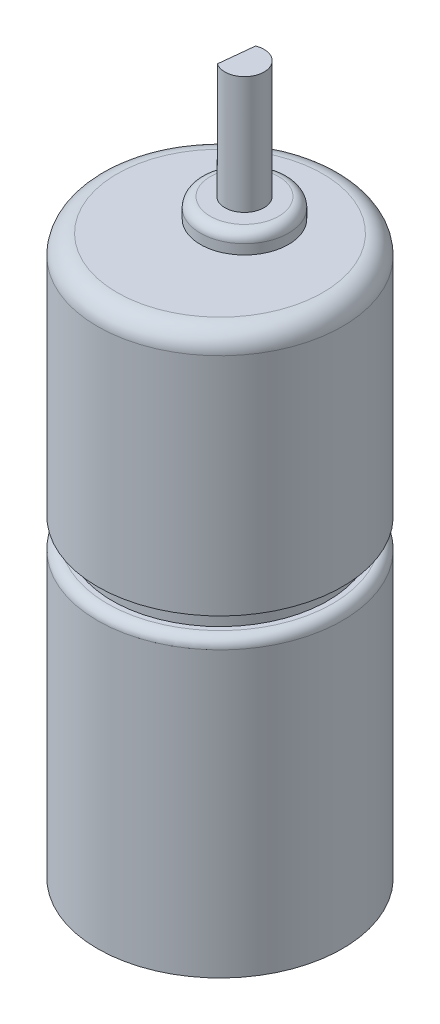
ISO-10303-21;
HEADER;
FILE_DESCRIPTION(('STEP AP214'),'2;1');
FILE_NAME('part.step','',(''),(''),'','','');
FILE_SCHEMA(('AUTOMOTIVE_DESIGN { 1 0 10303 214 1 1 1 1 }'));
ENDSEC;
DATA;
#1=APPLICATION_CONTEXT('core data for automotive mechanical design processes');
#2=APPLICATION_PROTOCOL_DEFINITION('international standard','automotive_design',2000,#1);
#3=PRODUCT_CONTEXT('',#1,'mechanical');
#4=PRODUCT('Part','Part','',(#3));
#5=PRODUCT_RELATED_PRODUCT_CATEGORY('part','',(#4));
#6=PRODUCT_DEFINITION_FORMATION('','',#4);
#7=PRODUCT_DEFINITION_CONTEXT('part definition',#1,'design');
#8=PRODUCT_DEFINITION('design','',#6,#7);
#9=PRODUCT_DEFINITION_SHAPE('','',#8);
#10=(LENGTH_UNIT() NAMED_UNIT(*) SI_UNIT(.MILLI.,.METRE.));
#11=(NAMED_UNIT(*) PLANE_ANGLE_UNIT() SI_UNIT($,.RADIAN.));
#12=(NAMED_UNIT(*) SI_UNIT($,.STERADIAN.) SOLID_ANGLE_UNIT());
#13=UNCERTAINTY_MEASURE_WITH_UNIT(LENGTH_MEASURE(1.E-05),#10,'distance_accuracy_value','');
#14=(GEOMETRIC_REPRESENTATION_CONTEXT(3) GLOBAL_UNCERTAINTY_ASSIGNED_CONTEXT((#13)) GLOBAL_UNIT_ASSIGNED_CONTEXT((#10,
#11,#12)) REPRESENTATION_CONTEXT('',''));
#15=CARTESIAN_POINT('',(0.,0.,0.));
#16=DIRECTION('',(0.,0.,1.));
#17=DIRECTION('',(1.,0.,0.));
#18=AXIS2_PLACEMENT_3D('',#15,#16,#17);
#19=CARTESIAN_POINT('',(0.,25.,0.));
#20=DIRECTION('',(0.,-1.,0.));
#21=DIRECTION('',(0.,0.,-1.));
#22=AXIS2_PLACEMENT_3D('',#19,#20,#21);
#23=CYLINDRICAL_SURFACE('',#22,12.5);
#24=CARTESIAN_POINT('',(0.,23.,0.));
#25=DIRECTION('',(0.,1.,0.));
#26=DIRECTION('',(0.,0.,1.));
#27=AXIS2_PLACEMENT_3D('',#24,#25,#26);
#28=CIRCLE('',#27,12.5);
#29=CARTESIAN_POINT('',(0.,23.,12.5));
#30=VERTEX_POINT('',#29);
#31=EDGE_CURVE('E113',#30,#30,#28,.F.);
#32=ORIENTED_EDGE('',*,*,#31,.T.);
#33=EDGE_LOOP('',(#32));
#34=FACE_BOUND('',#33,.T.);
#35=CARTESIAN_POINT('',(0.,0.,0.));
#36=DIRECTION('',(0.,1.,0.));
#37=DIRECTION('',(0.,0.,1.));
#38=AXIS2_PLACEMENT_3D('',#35,#36,#37);
#39=CIRCLE('',#38,12.5);
#40=CARTESIAN_POINT('',(0.,0.,12.5));
#41=VERTEX_POINT('',#40);
#42=EDGE_CURVE('E101',#41,#41,#39,.T.);
#43=ORIENTED_EDGE('',*,*,#42,.T.);
#44=EDGE_LOOP('',(#43));
#45=FACE_BOUND('',#44,.T.);
#46=ADVANCED_FACE('F42',(#34,#45),#23,.T.);
#47=CARTESIAN_POINT('',(0.,25.,0.));
#48=DIRECTION('',(0.,1.,0.));
#49=DIRECTION('',(0.,0.,1.));
#50=AXIS2_PLACEMENT_3D('',#47,#48,#49);
#51=PLANE('',#50);
#52=CARTESIAN_POINT('',(0.,25.,0.));
#53=DIRECTION('',(0.,1.,0.));
#54=DIRECTION('',(0.,0.,1.));
#55=AXIS2_PLACEMENT_3D('',#52,#53,#54);
#56=CIRCLE('',#55,10.5);
#57=CARTESIAN_POINT('',(0.,25.,10.5));
#58=VERTEX_POINT('',#57);
#59=EDGE_CURVE('E106',#58,#58,#56,.T.);
#60=ORIENTED_EDGE('',*,*,#59,.T.);
#61=EDGE_LOOP('',(#60));
#62=FACE_BOUND('',#61,.T.);
#63=CARTESIAN_POINT('',(0.,25.,-2.5));
#64=DIRECTION('',(0.,-1.,0.));
#65=DIRECTION('',(0.,0.,-1.));
#66=AXIS2_PLACEMENT_3D('',#63,#64,#65);
#67=CIRCLE('',#66,4.5);
#68=CARTESIAN_POINT('',(0.,25.,-7.));
#69=VERTEX_POINT('',#68);
#70=EDGE_CURVE('E86',#69,#69,#67,.T.);
#71=ORIENTED_EDGE('',*,*,#70,.T.);
#72=EDGE_LOOP('',(#71));
#73=FACE_BOUND('',#72,.T.);
#74=ADVANCED_FACE('F146',(#62,#73),#51,.T.);
#75=CARTESIAN_POINT('',(0.,0.,0.));
#76=DIRECTION('',(0.,1.,0.));
#77=DIRECTION('',(0.,0.,1.));
#78=AXIS2_PLACEMENT_3D('',#75,#76,#77);
#79=PLANE('',#78);
#80=CARTESIAN_POINT('',(0.,0.,0.));
#81=DIRECTION('',(0.,-1.,0.));
#82=DIRECTION('',(0.,0.,-1.));
#83=AXIS2_PLACEMENT_3D('',#80,#81,#82);
#84=CIRCLE('',#83,11.);
#85=CARTESIAN_POINT('',(0.,0.,-11.));
#86=VERTEX_POINT('',#85);
#87=EDGE_CURVE('E102',#86,#86,#84,.T.);
#88=ORIENTED_EDGE('',*,*,#87,.F.);
#89=EDGE_LOOP('',(#88));
#90=FACE_BOUND('',#89,.T.);
#91=ORIENTED_EDGE('',*,*,#42,.F.);
#92=EDGE_LOOP('',(#91));
#93=FACE_BOUND('',#92,.T.);
#94=ADVANCED_FACE('F148',(#90,#93),#79,.F.);
#95=CARTESIAN_POINT('',(0.,-2.,0.));
#96=DIRECTION('',(0.,1.,0.));
#97=DIRECTION('',(0.,0.,1.));
#98=AXIS2_PLACEMENT_3D('',#95,#96,#97);
#99=CYLINDRICAL_SURFACE('',#98,11.);
#100=CARTESIAN_POINT('',(0.,-2.,0.));
#101=DIRECTION('',(0.,-1.,0.));
#102=DIRECTION('',(0.,0.,-1.));
#103=AXIS2_PLACEMENT_3D('',#100,#101,#102);
#104=CIRCLE('',#103,11.);
#105=CARTESIAN_POINT('',(0.,-2.,-11.));
#106=VERTEX_POINT('',#105);
#107=EDGE_CURVE('E97',#106,#106,#104,.T.);
#108=ORIENTED_EDGE('',*,*,#107,.F.);
#109=EDGE_LOOP('',(#108));
#110=FACE_BOUND('',#109,.T.);
#111=ORIENTED_EDGE('',*,*,#87,.T.);
#112=EDGE_LOOP('',(#111));
#113=FACE_BOUND('',#112,.T.);
#114=ADVANCED_FACE('F155',(#110,#113),#99,.T.);
#115=CARTESIAN_POINT('',(0.,-32.,0.));
#116=DIRECTION('',(0.,1.,0.));
#117=DIRECTION('',(0.,0.,1.));
#118=AXIS2_PLACEMENT_3D('',#115,#116,#117);
#119=CYLINDRICAL_SURFACE('',#118,12.5);
#120=CARTESIAN_POINT('',(0.,-3.,0.));
#121=DIRECTION('',(0.,-1.,0.));
#122=DIRECTION('',(0.,0.,-1.));
#123=AXIS2_PLACEMENT_3D('',#120,#121,#122);
#124=CIRCLE('',#123,12.5);
#125=CARTESIAN_POINT('',(0.,-3.,-12.5));
#126=VERTEX_POINT('',#125);
#127=EDGE_CURVE('E117',#126,#126,#124,.T.);
#128=ORIENTED_EDGE('',*,*,#127,.T.);
#129=EDGE_LOOP('',(#128));
#130=FACE_BOUND('',#129,.T.);
#131=CARTESIAN_POINT('',(0.,-32.,0.));
#132=DIRECTION('',(0.,-1.,0.));
#133=DIRECTION('',(0.,0.,-1.));
#134=AXIS2_PLACEMENT_3D('',#131,#132,#133);
#135=CIRCLE('',#134,12.5);
#136=CARTESIAN_POINT('',(0.,-32.,-12.5));
#137=VERTEX_POINT('',#136);
#138=EDGE_CURVE('E90',#137,#137,#135,.T.);
#139=ORIENTED_EDGE('',*,*,#138,.F.);
#140=EDGE_LOOP('',(#139));
#141=FACE_BOUND('',#140,.T.);
#142=ADVANCED_FACE('F174',(#130,#141),#119,.T.);
#143=CARTESIAN_POINT('',(0.,-32.,0.));
#144=DIRECTION('',(0.,-1.,0.));
#145=DIRECTION('',(0.,0.,-1.));
#146=AXIS2_PLACEMENT_3D('',#143,#144,#145);
#147=PLANE('',#146);
#148=ORIENTED_EDGE('',*,*,#138,.T.);
#149=EDGE_LOOP('',(#148));
#150=FACE_BOUND('',#149,.T.);
#151=ADVANCED_FACE('F177',(#150),#147,.T.);
#152=CARTESIAN_POINT('',(0.,-2.,0.));
#153=DIRECTION('',(0.,-1.,0.));
#154=DIRECTION('',(0.,0.,-1.));
#155=AXIS2_PLACEMENT_3D('',#152,#153,#154);
#156=PLANE('',#155);
#157=CARTESIAN_POINT('',(0.,-2.,0.));
#158=DIRECTION('',(0.,-1.,0.));
#159=DIRECTION('',(0.,0.,-1.));
#160=AXIS2_PLACEMENT_3D('',#157,#158,#159);
#161=CIRCLE('',#160,11.5);
#162=CARTESIAN_POINT('',(0.,-2.,-11.5));
#163=VERTEX_POINT('',#162);
#164=EDGE_CURVE('E121',#163,#163,#161,.F.);
#165=ORIENTED_EDGE('',*,*,#164,.T.);
#166=EDGE_LOOP('',(#165));
#167=FACE_BOUND('',#166,.T.);
#168=ORIENTED_EDGE('',*,*,#107,.T.);
#169=EDGE_LOOP('',(#168));
#170=FACE_BOUND('',#169,.T.);
#171=ADVANCED_FACE('F142',(#167,#170),#156,.F.);
#172=CARTESIAN_POINT('',(0.,27.,-2.5));
#173=DIRECTION('',(0.,-1.,0.));
#174=DIRECTION('',(0.,0.,-1.));
#175=AXIS2_PLACEMENT_3D('',#172,#173,#174);
#176=CYLINDRICAL_SURFACE('',#175,4.5);
#177=CARTESIAN_POINT('',(0.,26.,-2.5));
#178=DIRECTION('',(0.,-1.,0.));
#179=DIRECTION('',(0.,0.,-1.));
#180=AXIS2_PLACEMENT_3D('',#177,#178,#179);
#181=CIRCLE('',#180,4.5);
#182=CARTESIAN_POINT('',(0.,26.,-7.));
#183=VERTEX_POINT('',#182);
#184=EDGE_CURVE('E125',#183,#183,#181,.T.);
#185=ORIENTED_EDGE('',*,*,#184,.T.);
#186=EDGE_LOOP('',(#185));
#187=FACE_BOUND('',#186,.T.);
#188=ORIENTED_EDGE('',*,*,#70,.F.);
#189=EDGE_LOOP('',(#188));
#190=FACE_BOUND('',#189,.T.);
#191=ADVANCED_FACE('F139',(#187,#190),#176,.T.);
#192=CARTESIAN_POINT('',(0.,27.,-2.5));
#193=DIRECTION('',(0.,-1.,0.));
#194=DIRECTION('',(0.,0.,-1.));
#195=AXIS2_PLACEMENT_3D('',#192,#193,#194);
#196=PLANE('',#195);
#197=CARTESIAN_POINT('',(0.,27.,-2.5));
#198=DIRECTION('',(0.,-1.,0.));
#199=DIRECTION('',(0.,0.,-1.));
#200=AXIS2_PLACEMENT_3D('',#197,#198,#199);
#201=CIRCLE('',#200,2.);
#202=CARTESIAN_POINT('',(0.,27.,-4.5));
#203=VERTEX_POINT('',#202);
#204=EDGE_CURVE('E11',#203,#203,#201,.F.);
#205=ORIENTED_EDGE('',*,*,#204,.F.);
#206=EDGE_LOOP('',(#205));
#207=FACE_BOUND('',#206,.T.);
#208=CARTESIAN_POINT('',(0.,27.,-2.5));
#209=DIRECTION('',(0.,-1.,0.));
#210=DIRECTION('',(0.,0.,-1.));
#211=AXIS2_PLACEMENT_3D('',#208,#209,#210);
#212=CIRCLE('',#211,3.5);
#213=CARTESIAN_POINT('',(0.,27.,-6.));
#214=VERTEX_POINT('',#213);
#215=EDGE_CURVE('E51',#214,#214,#212,.F.);
#216=ORIENTED_EDGE('',*,*,#215,.T.);
#217=EDGE_LOOP('',(#216));
#218=FACE_BOUND('',#217,.T.);
#219=ADVANCED_FACE('F132',(#207,#218),#196,.F.);
#220=CARTESIAN_POINT('',(0.,23.,0.));
#221=DIRECTION('',(0.,1.,0.));
#222=DIRECTION('',(0.,0.,1.));
#223=AXIS2_PLACEMENT_3D('',#220,#221,#222);
#224=TOROIDAL_SURFACE('',#223,10.5,2.);
#225=ORIENTED_EDGE('',*,*,#31,.F.);
#226=EDGE_LOOP('',(#225));
#227=FACE_BOUND('',#226,.T.);
#228=ORIENTED_EDGE('',*,*,#59,.F.);
#229=EDGE_LOOP('',(#228));
#230=FACE_BOUND('',#229,.T.);
#231=ADVANCED_FACE('F163',(#227,#230),#224,.T.);
#232=CARTESIAN_POINT('',(0.,-3.,0.));
#233=DIRECTION('',(0.,-1.,0.));
#234=DIRECTION('',(0.,0.,-1.));
#235=AXIS2_PLACEMENT_3D('',#232,#233,#234);
#236=TOROIDAL_SURFACE('',#235,11.5,1.);
#237=ORIENTED_EDGE('',*,*,#164,.F.);
#238=EDGE_LOOP('',(#237));
#239=FACE_BOUND('',#238,.T.);
#240=ORIENTED_EDGE('',*,*,#127,.F.);
#241=EDGE_LOOP('',(#240));
#242=FACE_BOUND('',#241,.T.);
#243=ADVANCED_FACE('F136',(#239,#242),#236,.T.);
#244=CARTESIAN_POINT('',(0.,26.,-2.5));
#245=DIRECTION('',(0.,-1.,0.));
#246=DIRECTION('',(0.,0.,-1.));
#247=AXIS2_PLACEMENT_3D('',#244,#245,#246);
#248=TOROIDAL_SURFACE('',#247,3.5,1.);
#249=ORIENTED_EDGE('',*,*,#215,.F.);
#250=EDGE_LOOP('',(#249));
#251=FACE_BOUND('',#250,.T.);
#252=ORIENTED_EDGE('',*,*,#184,.F.);
#253=EDGE_LOOP('',(#252));
#254=FACE_BOUND('',#253,.T.);
#255=ADVANCED_FACE('F44',(#251,#254),#248,.T.);
#256=CARTESIAN_POINT('',(0.,39.,-2.5));
#257=DIRECTION('',(0.,-1.,0.));
#258=DIRECTION('',(0.,0.,-1.));
#259=AXIS2_PLACEMENT_3D('',#256,#257,#258);
#260=CYLINDRICAL_SURFACE('',#259,2.);
#261=CARTESIAN_POINT('',(0.,39.,-2.5));
#262=DIRECTION('',(0.,1.,0.));
#263=DIRECTION('',(0.,0.,1.));
#264=AXIS2_PLACEMENT_3D('',#261,#262,#263);
#265=CIRCLE('',#264,2.);
#266=CARTESIAN_POINT('',(-1.10370333668893,39.,-0.832115428279963));
#267=VERTEX_POINT('',#266);
#268=CARTESIAN_POINT('',(-0.731515285573548,39.,-4.36142026070747));
#269=VERTEX_POINT('',#268);
#270=EDGE_CURVE('E81',#267,#269,#265,.T.);
#271=ORIENTED_EDGE('',*,*,#270,.F.);
#272=DIRECTION('',(0.,1.,0.));
#273=VECTOR('',#272,1.);
#274=CARTESIAN_POINT('',(-1.10370333668893,30.,-0.832115428279962));
#275=LINE('',#274,#273);
#276=CARTESIAN_POINT('',(-1.10370333668893,30.,-0.832115428279962));
#277=VERTEX_POINT('',#276);
#278=EDGE_CURVE('E58',#277,#267,#275,.T.);
#279=ORIENTED_EDGE('',*,*,#278,.F.);
#280=CARTESIAN_POINT('',(0.,30.,-2.5));
#281=DIRECTION('',(0.,1.,0.));
#282=DIRECTION('',(0.,0.,1.));
#283=AXIS2_PLACEMENT_3D('',#280,#281,#282);
#284=CIRCLE('',#283,2.);
#285=CARTESIAN_POINT('',(-0.731515285573548,30.,-4.36142026070747));
#286=VERTEX_POINT('',#285);
#287=EDGE_CURVE('E75',#286,#277,#284,.T.);
#288=ORIENTED_EDGE('',*,*,#287,.F.);
#289=DIRECTION('',(0.,1.,0.));
#290=VECTOR('',#289,1.);
#291=CARTESIAN_POINT('',(-0.731515285573548,30.,-4.36142026070747));
#292=LINE('',#291,#290);
#293=EDGE_CURVE('E64',#286,#269,#292,.T.);
#294=ORIENTED_EDGE('',*,*,#293,.T.);
#295=EDGE_LOOP('',(#271,#279,#288,#294));
#296=FACE_BOUND('',#295,.T.);
#297=ORIENTED_EDGE('',*,*,#204,.T.);
#298=EDGE_LOOP('',(#297));
#299=FACE_BOUND('',#298,.T.);
#300=ADVANCED_FACE('F79',(#296,#299),#260,.T.);
#301=CARTESIAN_POINT('',(0.,39.,-2.5));
#302=DIRECTION('',(0.,1.,0.));
#303=DIRECTION('',(0.,0.,1.));
#304=AXIS2_PLACEMENT_3D('',#301,#302,#303);
#305=PLANE('',#304);
#306=DIRECTION('',(0.104874927981174,0.,-0.994485419441101));
#307=VECTOR('',#306,1.);
#308=CARTESIAN_POINT('',(-0.731515285573548,39.,-4.36142026070747));
#309=LINE('',#308,#307);
#310=EDGE_CURVE('E69',#267,#269,#309,.T.);
#311=ORIENTED_EDGE('',*,*,#310,.F.);
#312=ORIENTED_EDGE('',*,*,#270,.T.);
#313=EDGE_LOOP('',(#311,#312));
#314=FACE_BOUND('',#313,.T.);
#315=ADVANCED_FACE('F84',(#314),#305,.T.);
#316=CARTESIAN_POINT('',(-0.731515285573548,30.,-4.36142026070747));
#317=DIRECTION('',(0.994485419441101,0.,0.104874927981174));
#318=DIRECTION('',(0.104874927981174,0.,-0.994485419441102));
#319=AXIS2_PLACEMENT_3D('',#316,#317,#318);
#320=PLANE('',#319);
#321=ORIENTED_EDGE('',*,*,#310,.T.);
#322=ORIENTED_EDGE('',*,*,#293,.F.);
#323=DIRECTION('',(0.104874927981174,0.,-0.994485419441101));
#324=VECTOR('',#323,1.);
#325=CARTESIAN_POINT('',(-0.731515285573548,30.,-4.36142026070747));
#326=LINE('',#325,#324);
#327=EDGE_CURVE('E202',#277,#286,#326,.T.);
#328=ORIENTED_EDGE('',*,*,#327,.F.);
#329=ORIENTED_EDGE('',*,*,#278,.T.);
#330=EDGE_LOOP('',(#321,#322,#328,#329));
#331=FACE_BOUND('',#330,.T.);
#332=ADVANCED_FACE('F70',(#331),#320,.F.);
#333=CARTESIAN_POINT('',(0.,30.,-2.5));
#334=DIRECTION('',(0.,1.,0.));
#335=DIRECTION('',(0.,0.,1.));
#336=AXIS2_PLACEMENT_3D('',#333,#334,#335);
#337=PLANE('',#336);
#338=ORIENTED_EDGE('',*,*,#287,.T.);
#339=ORIENTED_EDGE('',*,*,#327,.T.);
#340=EDGE_LOOP('',(#338,#339));
#341=FACE_BOUND('',#340,.T.);
#342=ADVANCED_FACE('F197',(#341),#337,.T.);
#343=CLOSED_SHELL('',(#46,#74,#94,#114,#142,#151,#171,#191,#219,#231,#243,#255,#300,#315,#332,#342));
#344=MANIFOLD_SOLID_BREP('B2',#343);
#345=ADVANCED_BREP_SHAPE_REPRESENTATION('',(#18,#344),#14);
#346=SHAPE_DEFINITION_REPRESENTATION(#9,#345);
ENDSEC;
END-ISO-10303-21;
